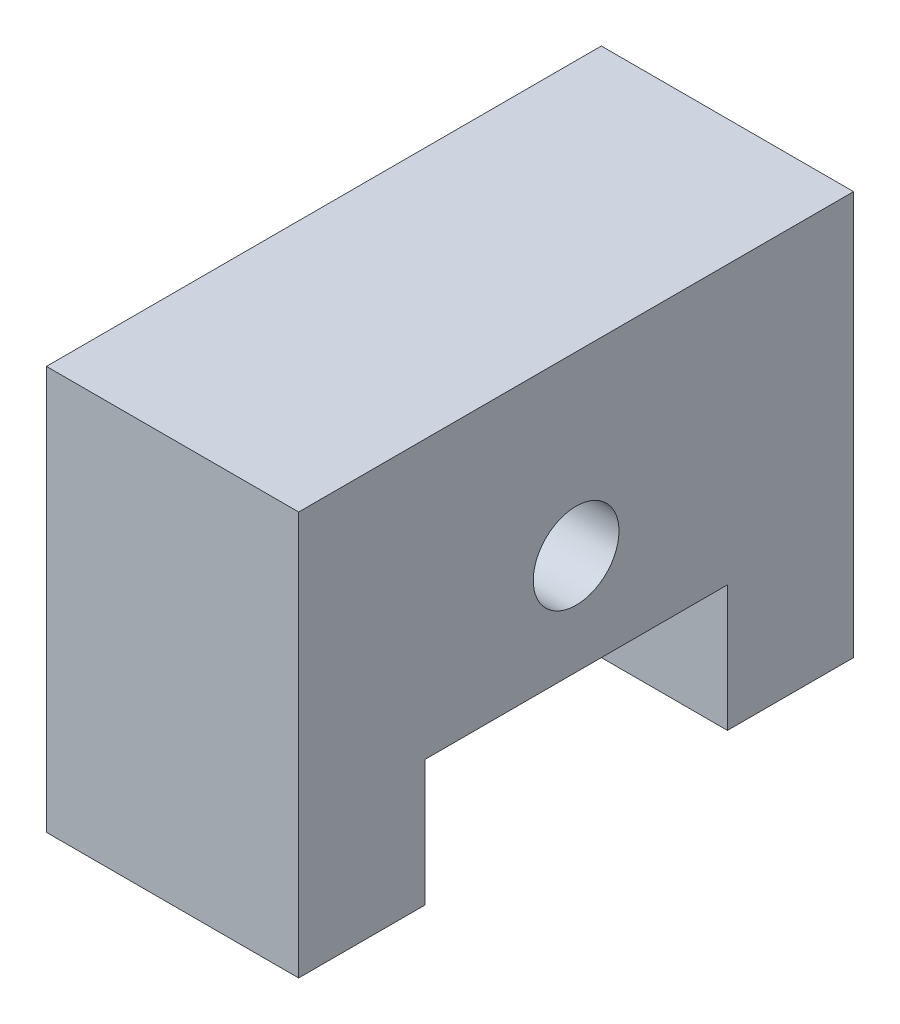
ISO-10303-21;
HEADER;
FILE_DESCRIPTION(('STEP AP214'),'2;1');
FILE_NAME('part.step','',(''),(''),'','','');
FILE_SCHEMA(('AUTOMOTIVE_DESIGN { 1 0 10303 214 1 1 1 1 }'));
ENDSEC;
DATA;
#1=APPLICATION_CONTEXT('core data for automotive mechanical design processes');
#2=APPLICATION_PROTOCOL_DEFINITION('international standard','automotive_design',2000,#1);
#3=PRODUCT_CONTEXT('',#1,'mechanical');
#4=PRODUCT('Part','Part','',(#3));
#5=PRODUCT_RELATED_PRODUCT_CATEGORY('part','',(#4));
#6=PRODUCT_DEFINITION_FORMATION('','',#4);
#7=PRODUCT_DEFINITION_CONTEXT('part definition',#1,'design');
#8=PRODUCT_DEFINITION('design','',#6,#7);
#9=PRODUCT_DEFINITION_SHAPE('','',#8);
#10=(LENGTH_UNIT() NAMED_UNIT(*) SI_UNIT(.MILLI.,.METRE.));
#11=(NAMED_UNIT(*) PLANE_ANGLE_UNIT() SI_UNIT($,.RADIAN.));
#12=(NAMED_UNIT(*) SI_UNIT($,.STERADIAN.) SOLID_ANGLE_UNIT());
#13=UNCERTAINTY_MEASURE_WITH_UNIT(LENGTH_MEASURE(1.E-05),#10,'distance_accuracy_value','');
#14=(GEOMETRIC_REPRESENTATION_CONTEXT(3) GLOBAL_UNCERTAINTY_ASSIGNED_CONTEXT((#13)) GLOBAL_UNIT_ASSIGNED_CONTEXT((#10,
#11,#12)) REPRESENTATION_CONTEXT('',''));
#15=CARTESIAN_POINT('',(0.,0.,0.));
#16=DIRECTION('',(0.,0.,1.));
#17=DIRECTION('',(1.,0.,0.));
#18=AXIS2_PLACEMENT_3D('',#15,#16,#17);
#19=CARTESIAN_POINT('',(10.,10.,12.));
#20=DIRECTION('',(0.,0.,1.));
#21=DIRECTION('',(0.,-1.,0.));
#22=AXIS2_PLACEMENT_3D('',#19,#20,#21);
#23=PLANE('',#22);
#24=DIRECTION('',(0.,1.,0.));
#25=VECTOR('',#24,1.);
#26=CARTESIAN_POINT('',(-10.,10.,12.));
#27=LINE('',#26,#25);
#28=CARTESIAN_POINT('',(-10.,0.,12.));
#29=VERTEX_POINT('',#28);
#30=CARTESIAN_POINT('',(-10.,10.,12.));
#31=VERTEX_POINT('',#30);
#32=EDGE_CURVE('E148',#29,#31,#27,.T.);
#33=ORIENTED_EDGE('',*,*,#32,.T.);
#34=DIRECTION('',(-1.,0.,0.));
#35=VECTOR('',#34,1.);
#36=CARTESIAN_POINT('',(10.,10.,12.));
#37=LINE('',#36,#35);
#38=CARTESIAN_POINT('',(10.,10.,12.));
#39=VERTEX_POINT('',#38);
#40=EDGE_CURVE('E11',#39,#31,#37,.T.);
#41=ORIENTED_EDGE('',*,*,#40,.F.);
#42=DIRECTION('',(0.,1.,0.));
#43=VECTOR('',#42,1.);
#44=CARTESIAN_POINT('',(10.,10.,12.));
#45=LINE('',#44,#43);
#46=CARTESIAN_POINT('',(10.,0.,12.));
#47=VERTEX_POINT('',#46);
#48=EDGE_CURVE('E163',#47,#39,#45,.T.);
#49=ORIENTED_EDGE('',*,*,#48,.F.);
#50=DIRECTION('',(-1.,0.,0.));
#51=VECTOR('',#50,1.);
#52=CARTESIAN_POINT('',(10.,0.,12.));
#53=LINE('',#52,#51);
#54=EDGE_CURVE('E144',#47,#29,#53,.T.);
#55=ORIENTED_EDGE('',*,*,#54,.T.);
#56=EDGE_LOOP('',(#33,#41,#49,#55));
#57=FACE_BOUND('',#56,.T.);
#58=ADVANCED_FACE('F49',(#57),#23,.F.);
#59=CARTESIAN_POINT('',(10.,10.,-12.));
#60=DIRECTION('',(0.,1.,0.));
#61=DIRECTION('',(0.,0.,1.));
#62=AXIS2_PLACEMENT_3D('',#59,#60,#61);
#63=PLANE('',#62);
#64=DIRECTION('',(0.,0.,-1.));
#65=VECTOR('',#64,1.);
#66=CARTESIAN_POINT('',(-10.,10.,-12.));
#67=LINE('',#66,#65);
#68=CARTESIAN_POINT('',(-10.,10.,-12.));
#69=VERTEX_POINT('',#68);
#70=EDGE_CURVE('E151',#31,#69,#67,.T.);
#71=ORIENTED_EDGE('',*,*,#70,.T.);
#72=DIRECTION('',(-1.,0.,0.));
#73=VECTOR('',#72,1.);
#74=CARTESIAN_POINT('',(10.,10.,-12.));
#75=LINE('',#74,#73);
#76=CARTESIAN_POINT('',(10.,10.,-12.));
#77=VERTEX_POINT('',#76);
#78=EDGE_CURVE('E57',#77,#69,#75,.T.);
#79=ORIENTED_EDGE('',*,*,#78,.F.);
#80=DIRECTION('',(0.,0.,-1.));
#81=VECTOR('',#80,1.);
#82=CARTESIAN_POINT('',(10.,10.,-12.));
#83=LINE('',#82,#81);
#84=EDGE_CURVE('E109',#39,#77,#83,.T.);
#85=ORIENTED_EDGE('',*,*,#84,.F.);
#86=ORIENTED_EDGE('',*,*,#40,.T.);
#87=EDGE_LOOP('',(#71,#79,#85,#86));
#88=FACE_BOUND('',#87,.T.);
#89=ADVANCED_FACE('F223',(#88),#63,.F.);
#90=CARTESIAN_POINT('',(10.,10.,-12.));
#91=DIRECTION('',(0.,0.,-1.));
#92=DIRECTION('',(0.,1.,0.));
#93=AXIS2_PLACEMENT_3D('',#90,#91,#92);
#94=PLANE('',#93);
#95=DIRECTION('',(0.,-1.,0.));
#96=VECTOR('',#95,1.);
#97=CARTESIAN_POINT('',(-10.,10.,-12.));
#98=LINE('',#97,#96);
#99=CARTESIAN_POINT('',(-10.,0.,-12.));
#100=VERTEX_POINT('',#99);
#101=EDGE_CURVE('E154',#69,#100,#98,.T.);
#102=ORIENTED_EDGE('',*,*,#101,.T.);
#103=DIRECTION('',(-1.,0.,0.));
#104=VECTOR('',#103,1.);
#105=CARTESIAN_POINT('',(10.,0.,-12.));
#106=LINE('',#105,#104);
#107=CARTESIAN_POINT('',(10.,0.,-12.));
#108=VERTEX_POINT('',#107);
#109=EDGE_CURVE('E170',#108,#100,#106,.T.);
#110=ORIENTED_EDGE('',*,*,#109,.F.);
#111=DIRECTION('',(0.,-1.,0.));
#112=VECTOR('',#111,1.);
#113=CARTESIAN_POINT('',(10.,10.,-12.));
#114=LINE('',#113,#112);
#115=EDGE_CURVE('E178',#77,#108,#114,.T.);
#116=ORIENTED_EDGE('',*,*,#115,.F.);
#117=ORIENTED_EDGE('',*,*,#78,.T.);
#118=EDGE_LOOP('',(#102,#110,#116,#117));
#119=FACE_BOUND('',#118,.T.);
#120=ADVANCED_FACE('F176',(#119),#94,.F.);
#121=CARTESIAN_POINT('',(10.,0.,-12.));
#122=DIRECTION('',(0.,1.,0.));
#123=DIRECTION('',(0.,0.,1.));
#124=AXIS2_PLACEMENT_3D('',#121,#122,#123);
#125=PLANE('',#124);
#126=CARTESIAN_POINT('',(0.,0.,-17.));
#127=DIRECTION('',(0.,-1.,0.));
#128=DIRECTION('',(0.,0.,-1.));
#129=AXIS2_PLACEMENT_3D('',#126,#127,#128);
#130=CIRCLE('',#129,2.1);
#131=CARTESIAN_POINT('',(0.,0.,-19.1));
#132=VERTEX_POINT('',#131);
#133=EDGE_CURVE('E210',#132,#132,#130,.T.);
#134=ORIENTED_EDGE('',*,*,#133,.F.);
#135=EDGE_LOOP('',(#134));
#136=FACE_BOUND('',#135,.T.);
#137=DIRECTION('',(0.,0.,-1.));
#138=VECTOR('',#137,1.);
#139=CARTESIAN_POINT('',(-10.,0.,-12.));
#140=LINE('',#139,#138);
#141=CARTESIAN_POINT('',(-10.,0.,-22.));
#142=VERTEX_POINT('',#141);
#143=EDGE_CURVE('E156',#100,#142,#140,.T.);
#144=ORIENTED_EDGE('',*,*,#143,.T.);
#145=DIRECTION('',(-1.,0.,0.));
#146=VECTOR('',#145,1.);
#147=CARTESIAN_POINT('',(10.,0.,-22.));
#148=LINE('',#147,#146);
#149=CARTESIAN_POINT('',(10.,0.,-22.));
#150=VERTEX_POINT('',#149);
#151=EDGE_CURVE('E167',#150,#142,#148,.T.);
#152=ORIENTED_EDGE('',*,*,#151,.F.);
#153=DIRECTION('',(0.,0.,-1.));
#154=VECTOR('',#153,1.);
#155=CARTESIAN_POINT('',(10.,0.,-12.));
#156=LINE('',#155,#154);
#157=EDGE_CURVE('E190',#108,#150,#156,.T.);
#158=ORIENTED_EDGE('',*,*,#157,.F.);
#159=ORIENTED_EDGE('',*,*,#109,.T.);
#160=EDGE_LOOP('',(#144,#152,#158,#159));
#161=FACE_BOUND('',#160,.T.);
#162=ADVANCED_FACE('F186',(#136,#161),#125,.F.);
#163=CARTESIAN_POINT('',(10.,0.,-22.));
#164=DIRECTION('',(0.,0.,1.));
#165=DIRECTION('',(1.,0.,0.));
#166=AXIS2_PLACEMENT_3D('',#163,#164,#165);
#167=PLANE('',#166);
#168=DIRECTION('',(0.,1.,0.));
#169=VECTOR('',#168,1.);
#170=CARTESIAN_POINT('',(-10.,0.,-22.));
#171=LINE('',#170,#169);
#172=CARTESIAN_POINT('',(-10.,32.,-22.));
#173=VERTEX_POINT('',#172);
#174=EDGE_CURVE('E158',#142,#173,#171,.T.);
#175=ORIENTED_EDGE('',*,*,#174,.T.);
#176=DIRECTION('',(-1.,0.,0.));
#177=VECTOR('',#176,1.);
#178=CARTESIAN_POINT('',(10.,32.,-22.));
#179=LINE('',#178,#177);
#180=CARTESIAN_POINT('',(10.,32.,-22.));
#181=VERTEX_POINT('',#180);
#182=EDGE_CURVE('E139',#181,#173,#179,.T.);
#183=ORIENTED_EDGE('',*,*,#182,.F.);
#184=DIRECTION('',(0.,1.,0.));
#185=VECTOR('',#184,1.);
#186=CARTESIAN_POINT('',(10.,0.,-22.));
#187=LINE('',#186,#185);
#188=EDGE_CURVE('E130',#150,#181,#187,.T.);
#189=ORIENTED_EDGE('',*,*,#188,.F.);
#190=ORIENTED_EDGE('',*,*,#151,.T.);
#191=EDGE_LOOP('',(#175,#183,#189,#190));
#192=FACE_BOUND('',#191,.T.);
#193=ADVANCED_FACE('F189',(#192),#167,.F.);
#194=CARTESIAN_POINT('',(10.,32.,22.));
#195=DIRECTION('',(0.,-1.,0.));
#196=DIRECTION('',(0.,0.,-1.));
#197=AXIS2_PLACEMENT_3D('',#194,#195,#196);
#198=PLANE('',#197);
#199=DIRECTION('',(0.,0.,1.));
#200=VECTOR('',#199,1.);
#201=CARTESIAN_POINT('',(-10.,32.,22.));
#202=LINE('',#201,#200);
#203=CARTESIAN_POINT('',(-10.,32.,22.));
#204=VERTEX_POINT('',#203);
#205=EDGE_CURVE('E138',#173,#204,#202,.T.);
#206=ORIENTED_EDGE('',*,*,#205,.T.);
#207=DIRECTION('',(-1.,0.,0.));
#208=VECTOR('',#207,1.);
#209=CARTESIAN_POINT('',(10.,32.,22.));
#210=LINE('',#209,#208);
#211=CARTESIAN_POINT('',(10.,32.,22.));
#212=VERTEX_POINT('',#211);
#213=EDGE_CURVE('E135',#212,#204,#210,.T.);
#214=ORIENTED_EDGE('',*,*,#213,.F.);
#215=DIRECTION('',(0.,0.,1.));
#216=VECTOR('',#215,1.);
#217=CARTESIAN_POINT('',(10.,32.,22.));
#218=LINE('',#217,#216);
#219=EDGE_CURVE('E124',#181,#212,#218,.T.);
#220=ORIENTED_EDGE('',*,*,#219,.F.);
#221=ORIENTED_EDGE('',*,*,#182,.T.);
#222=EDGE_LOOP('',(#206,#214,#220,#221));
#223=FACE_BOUND('',#222,.T.);
#224=ADVANCED_FACE('F136',(#223),#198,.F.);
#225=CARTESIAN_POINT('',(10.,0.,22.));
#226=DIRECTION('',(0.,0.,-1.));
#227=DIRECTION('',(-1.,0.,0.));
#228=AXIS2_PLACEMENT_3D('',#225,#226,#227);
#229=PLANE('',#228);
#230=DIRECTION('',(0.,-1.,0.));
#231=VECTOR('',#230,1.);
#232=CARTESIAN_POINT('',(-10.,0.,22.));
#233=LINE('',#232,#231);
#234=CARTESIAN_POINT('',(-10.,0.,22.));
#235=VERTEX_POINT('',#234);
#236=EDGE_CURVE('E95',#204,#235,#233,.T.);
#237=ORIENTED_EDGE('',*,*,#236,.T.);
#238=DIRECTION('',(-1.,0.,0.));
#239=VECTOR('',#238,1.);
#240=CARTESIAN_POINT('',(10.,0.,22.));
#241=LINE('',#240,#239);
#242=CARTESIAN_POINT('',(10.,0.,22.));
#243=VERTEX_POINT('',#242);
#244=EDGE_CURVE('E140',#243,#235,#241,.T.);
#245=ORIENTED_EDGE('',*,*,#244,.F.);
#246=DIRECTION('',(0.,-1.,0.));
#247=VECTOR('',#246,1.);
#248=CARTESIAN_POINT('',(10.,0.,22.));
#249=LINE('',#248,#247);
#250=EDGE_CURVE('E128',#212,#243,#249,.T.);
#251=ORIENTED_EDGE('',*,*,#250,.F.);
#252=ORIENTED_EDGE('',*,*,#213,.T.);
#253=EDGE_LOOP('',(#237,#245,#251,#252));
#254=FACE_BOUND('',#253,.T.);
#255=ADVANCED_FACE('F142',(#254),#229,.F.);
#256=CARTESIAN_POINT('',(10.,0.,12.));
#257=DIRECTION('',(0.,1.,0.));
#258=DIRECTION('',(0.,0.,1.));
#259=AXIS2_PLACEMENT_3D('',#256,#257,#258);
#260=PLANE('',#259);
#261=CARTESIAN_POINT('',(0.,0.,17.));
#262=DIRECTION('',(0.,-1.,0.));
#263=DIRECTION('',(0.,0.,-1.));
#264=AXIS2_PLACEMENT_3D('',#261,#262,#263);
#265=CIRCLE('',#264,2.1);
#266=CARTESIAN_POINT('',(0.,0.,14.9));
#267=VERTEX_POINT('',#266);
#268=EDGE_CURVE('E204',#267,#267,#265,.T.);
#269=ORIENTED_EDGE('',*,*,#268,.F.);
#270=EDGE_LOOP('',(#269));
#271=FACE_BOUND('',#270,.T.);
#272=DIRECTION('',(0.,0.,-1.));
#273=VECTOR('',#272,1.);
#274=CARTESIAN_POINT('',(-10.,0.,12.));
#275=LINE('',#274,#273);
#276=EDGE_CURVE('E101',#235,#29,#275,.T.);
#277=ORIENTED_EDGE('',*,*,#276,.T.);
#278=ORIENTED_EDGE('',*,*,#54,.F.);
#279=DIRECTION('',(0.,0.,-1.));
#280=VECTOR('',#279,1.);
#281=CARTESIAN_POINT('',(10.,0.,12.));
#282=LINE('',#281,#280);
#283=EDGE_CURVE('E65',#243,#47,#282,.T.);
#284=ORIENTED_EDGE('',*,*,#283,.F.);
#285=ORIENTED_EDGE('',*,*,#244,.T.);
#286=EDGE_LOOP('',(#277,#278,#284,#285));
#287=FACE_BOUND('',#286,.T.);
#288=ADVANCED_FACE('F232',(#271,#287),#260,.F.);
#289=CARTESIAN_POINT('',(10.,0.,0.));
#290=DIRECTION('',(-1.,0.,0.));
#291=DIRECTION('',(0.,0.,1.));
#292=AXIS2_PLACEMENT_3D('',#289,#290,#291);
#293=PLANE('',#292);
#294=CARTESIAN_POINT('',(10.,18.,0.));
#295=DIRECTION('',(1.,0.,0.));
#296=DIRECTION('',(0.,0.,-1.));
#297=AXIS2_PLACEMENT_3D('',#294,#295,#296);
#298=CIRCLE('',#297,3.39999999999999);
#299=CARTESIAN_POINT('',(10.,18.,-3.39999999999999));
#300=VERTEX_POINT('',#299);
#301=EDGE_CURVE('E198',#300,#300,#298,.T.);
#302=ORIENTED_EDGE('',*,*,#301,.F.);
#303=EDGE_LOOP('',(#302));
#304=FACE_BOUND('',#303,.T.);
#305=ORIENTED_EDGE('',*,*,#48,.T.);
#306=ORIENTED_EDGE('',*,*,#84,.T.);
#307=ORIENTED_EDGE('',*,*,#115,.T.);
#308=ORIENTED_EDGE('',*,*,#157,.T.);
#309=ORIENTED_EDGE('',*,*,#188,.T.);
#310=ORIENTED_EDGE('',*,*,#219,.T.);
#311=ORIENTED_EDGE('',*,*,#250,.T.);
#312=ORIENTED_EDGE('',*,*,#283,.T.);
#313=EDGE_LOOP('',(#305,#306,#307,#308,#309,#310,#311,#312));
#314=FACE_BOUND('',#313,.T.);
#315=ADVANCED_FACE('F126',(#304,#314),#293,.F.);
#316=CARTESIAN_POINT('',(-10.,0.,0.));
#317=DIRECTION('',(-1.,0.,0.));
#318=DIRECTION('',(0.,0.,1.));
#319=AXIS2_PLACEMENT_3D('',#316,#317,#318);
#320=PLANE('',#319);
#321=ORIENTED_EDGE('',*,*,#32,.F.);
#322=ORIENTED_EDGE('',*,*,#276,.F.);
#323=ORIENTED_EDGE('',*,*,#236,.F.);
#324=ORIENTED_EDGE('',*,*,#205,.F.);
#325=ORIENTED_EDGE('',*,*,#174,.F.);
#326=ORIENTED_EDGE('',*,*,#143,.F.);
#327=ORIENTED_EDGE('',*,*,#101,.F.);
#328=ORIENTED_EDGE('',*,*,#70,.F.);
#329=EDGE_LOOP('',(#321,#322,#323,#324,#325,#326,#327,#328));
#330=FACE_BOUND('',#329,.T.);
#331=ADVANCED_FACE('F182',(#330),#320,.T.);
#332=CARTESIAN_POINT('',(-4.,18.,0.));
#333=DIRECTION('',(1.,0.,0.));
#334=DIRECTION('',(0.,0.,-1.));
#335=AXIS2_PLACEMENT_3D('',#332,#333,#334);
#336=CONICAL_SURFACE('',#335,3.4,1.02974425867665);
#337=CARTESIAN_POINT('',(-6.0429261046937,18.,0.));
#338=VERTEX_POINT('',#337);
#339=VERTEX_LOOP('',#338);
#340=FACE_BOUND('',#339,.T.);
#341=CARTESIAN_POINT('',(-4.,18.,0.));
#342=DIRECTION('',(1.,0.,0.));
#343=DIRECTION('',(0.,0.,-1.));
#344=AXIS2_PLACEMENT_3D('',#341,#342,#343);
#345=CIRCLE('',#344,3.4);
#346=CARTESIAN_POINT('',(-4.,18.,-3.4));
#347=VERTEX_POINT('',#346);
#348=EDGE_CURVE('E152',#347,#347,#345,.T.);
#349=ORIENTED_EDGE('',*,*,#348,.T.);
#350=EDGE_LOOP('',(#349));
#351=FACE_BOUND('',#350,.T.);
#352=ADVANCED_FACE('F264',(#340,#351),#336,.F.);
#353=CARTESIAN_POINT('',(10.,18.,0.));
#354=DIRECTION('',(1.,0.,0.));
#355=DIRECTION('',(0.,0.,-1.));
#356=AXIS2_PLACEMENT_3D('',#353,#354,#355);
#357=CYLINDRICAL_SURFACE('',#356,3.39999999999999);
#358=ORIENTED_EDGE('',*,*,#348,.F.);
#359=EDGE_LOOP('',(#358));
#360=FACE_BOUND('',#359,.T.);
#361=ORIENTED_EDGE('',*,*,#301,.T.);
#362=EDGE_LOOP('',(#361));
#363=FACE_BOUND('',#362,.T.);
#364=ADVANCED_FACE('F278',(#360,#363),#357,.F.);
#365=CARTESIAN_POINT('',(0.,12.,17.));
#366=DIRECTION('',(0.,-1.,0.));
#367=DIRECTION('',(0.,0.,-1.));
#368=AXIS2_PLACEMENT_3D('',#365,#366,#367);
#369=CONICAL_SURFACE('',#368,2.1,1.02974425867665);
#370=CARTESIAN_POINT('',(0.,13.2618072999579,17.));
#371=VERTEX_POINT('',#370);
#372=VERTEX_LOOP('',#371);
#373=FACE_BOUND('',#372,.T.);
#374=CARTESIAN_POINT('',(0.,12.,17.));
#375=DIRECTION('',(0.,-1.,0.));
#376=DIRECTION('',(0.,0.,-1.));
#377=AXIS2_PLACEMENT_3D('',#374,#375,#376);
#378=CIRCLE('',#377,2.1);
#379=CARTESIAN_POINT('',(0.,12.,14.9));
#380=VERTEX_POINT('',#379);
#381=EDGE_CURVE('E201',#380,#380,#378,.T.);
#382=ORIENTED_EDGE('',*,*,#381,.T.);
#383=EDGE_LOOP('',(#382));
#384=FACE_BOUND('',#383,.T.);
#385=ADVANCED_FACE('F288',(#373,#384),#369,.F.);
#386=CARTESIAN_POINT('',(0.,0.,17.));
#387=DIRECTION('',(0.,-1.,0.));
#388=DIRECTION('',(0.,0.,-1.));
#389=AXIS2_PLACEMENT_3D('',#386,#387,#388);
#390=CYLINDRICAL_SURFACE('',#389,2.1);
#391=ORIENTED_EDGE('',*,*,#381,.F.);
#392=EDGE_LOOP('',(#391));
#393=FACE_BOUND('',#392,.T.);
#394=ORIENTED_EDGE('',*,*,#268,.T.);
#395=EDGE_LOOP('',(#394));
#396=FACE_BOUND('',#395,.T.);
#397=ADVANCED_FACE('F309',(#393,#396),#390,.F.);
#398=CARTESIAN_POINT('',(0.,12.,-17.));
#399=DIRECTION('',(0.,-1.,0.));
#400=DIRECTION('',(0.,0.,-1.));
#401=AXIS2_PLACEMENT_3D('',#398,#399,#400);
#402=CONICAL_SURFACE('',#401,2.1,1.02974425867665);
#403=CARTESIAN_POINT('',(0.,13.2618072999579,-17.));
#404=VERTEX_POINT('',#403);
#405=VERTEX_LOOP('',#404);
#406=FACE_BOUND('',#405,.T.);
#407=CARTESIAN_POINT('',(0.,12.,-17.));
#408=DIRECTION('',(0.,-1.,0.));
#409=DIRECTION('',(0.,0.,-1.));
#410=AXIS2_PLACEMENT_3D('',#407,#408,#409);
#411=CIRCLE('',#410,2.1);
#412=CARTESIAN_POINT('',(0.,12.,-19.1));
#413=VERTEX_POINT('',#412);
#414=EDGE_CURVE('E207',#413,#413,#411,.T.);
#415=ORIENTED_EDGE('',*,*,#414,.T.);
#416=EDGE_LOOP('',(#415));
#417=FACE_BOUND('',#416,.T.);
#418=ADVANCED_FACE('F318',(#406,#417),#402,.F.);
#419=CARTESIAN_POINT('',(0.,0.,-17.));
#420=DIRECTION('',(0.,-1.,0.));
#421=DIRECTION('',(0.,0.,-1.));
#422=AXIS2_PLACEMENT_3D('',#419,#420,#421);
#423=CYLINDRICAL_SURFACE('',#422,2.1);
#424=ORIENTED_EDGE('',*,*,#414,.F.);
#425=EDGE_LOOP('',(#424));
#426=FACE_BOUND('',#425,.T.);
#427=ORIENTED_EDGE('',*,*,#133,.T.);
#428=EDGE_LOOP('',(#427));
#429=FACE_BOUND('',#428,.T.);
#430=ADVANCED_FACE('F214',(#426,#429),#423,.F.);
#431=CLOSED_SHELL('',(#58,#89,#120,#162,#193,#224,#255,#288,#315,#331,#352,#364,#385,#397,#418,#430));
#432=MANIFOLD_SOLID_BREP('B2',#431);
#433=ADVANCED_BREP_SHAPE_REPRESENTATION('',(#18,#432),#14);
#434=SHAPE_DEFINITION_REPRESENTATION(#9,#433);
ENDSEC;
END-ISO-10303-21;
